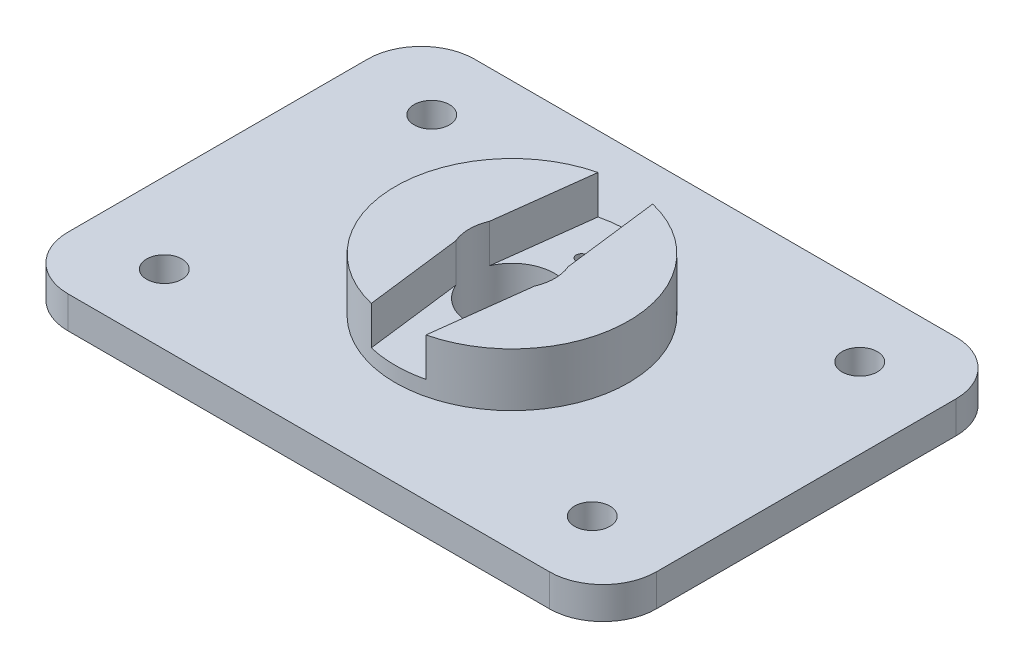
ISO-10303-21;
HEADER;
FILE_DESCRIPTION(('STEP AP214'),'2;1');
FILE_NAME('part.step','',(''),(''),'','','');
FILE_SCHEMA(('AUTOMOTIVE_DESIGN { 1 0 10303 214 1 1 1 1 }'));
ENDSEC;
DATA;
#1=APPLICATION_CONTEXT('core data for automotive mechanical design processes');
#2=APPLICATION_PROTOCOL_DEFINITION('international standard','automotive_design',2000,#1);
#3=PRODUCT_CONTEXT('',#1,'mechanical');
#4=PRODUCT('Part','Part','',(#3));
#5=PRODUCT_RELATED_PRODUCT_CATEGORY('part','',(#4));
#6=PRODUCT_DEFINITION_FORMATION('','',#4);
#7=PRODUCT_DEFINITION_CONTEXT('part definition',#1,'design');
#8=PRODUCT_DEFINITION('design','',#6,#7);
#9=PRODUCT_DEFINITION_SHAPE('','',#8);
#10=(LENGTH_UNIT() NAMED_UNIT(*) SI_UNIT(.MILLI.,.METRE.));
#11=(NAMED_UNIT(*) PLANE_ANGLE_UNIT() SI_UNIT($,.RADIAN.));
#12=(NAMED_UNIT(*) SI_UNIT($,.STERADIAN.) SOLID_ANGLE_UNIT());
#13=UNCERTAINTY_MEASURE_WITH_UNIT(LENGTH_MEASURE(1.E-05),#10,'distance_accuracy_value','');
#14=(GEOMETRIC_REPRESENTATION_CONTEXT(3) GLOBAL_UNCERTAINTY_ASSIGNED_CONTEXT((#13)) GLOBAL_UNIT_ASSIGNED_CONTEXT((#10,
#11,#12)) REPRESENTATION_CONTEXT('',''));
#15=CARTESIAN_POINT('',(0.,0.,0.));
#16=DIRECTION('',(0.,0.,1.));
#17=DIRECTION('',(1.,0.,0.));
#18=AXIS2_PLACEMENT_3D('',#15,#16,#17);
#19=CARTESIAN_POINT('',(22.5,3.,-14.));
#20=DIRECTION('',(0.,1.,0.));
#21=DIRECTION('',(0.,0.,1.));
#22=AXIS2_PLACEMENT_3D('',#19,#20,#21);
#23=CYLINDRICAL_SURFACE('',#22,5.);
#24=DIRECTION('',(0.,1.,0.));
#25=VECTOR('',#24,1.);
#26=CARTESIAN_POINT('',(27.5,3.,-14.));
#27=LINE('',#26,#25);
#28=CARTESIAN_POINT('',(27.5,0.,-14.));
#29=VERTEX_POINT('',#28);
#30=CARTESIAN_POINT('',(27.5,3.,-14.));
#31=VERTEX_POINT('',#30);
#32=EDGE_CURVE('E273',#29,#31,#27,.T.);
#33=ORIENTED_EDGE('',*,*,#32,.F.);
#34=CARTESIAN_POINT('',(22.5,0.,-14.));
#35=DIRECTION('',(0.,1.,0.));
#36=DIRECTION('',(0.,0.,1.));
#37=AXIS2_PLACEMENT_3D('',#34,#35,#36);
#38=CIRCLE('',#37,5.);
#39=CARTESIAN_POINT('',(22.5,0.,-19.));
#40=VERTEX_POINT('',#39);
#41=EDGE_CURVE('E45',#40,#29,#38,.F.);
#42=ORIENTED_EDGE('',*,*,#41,.F.);
#43=DIRECTION('',(0.,1.,0.));
#44=VECTOR('',#43,1.);
#45=CARTESIAN_POINT('',(22.5,3.,-19.));
#46=LINE('',#45,#44);
#47=CARTESIAN_POINT('',(22.5,3.,-19.));
#48=VERTEX_POINT('',#47);
#49=EDGE_CURVE('E276',#48,#40,#46,.F.);
#50=ORIENTED_EDGE('',*,*,#49,.F.);
#51=CARTESIAN_POINT('',(22.5,3.,-14.));
#52=DIRECTION('',(0.,1.,0.));
#53=DIRECTION('',(0.,0.,1.));
#54=AXIS2_PLACEMENT_3D('',#51,#52,#53);
#55=CIRCLE('',#54,5.);
#56=EDGE_CURVE('E11',#31,#48,#55,.T.);
#57=ORIENTED_EDGE('',*,*,#56,.F.);
#58=EDGE_LOOP('',(#33,#42,#50,#57));
#59=FACE_BOUND('',#58,.T.);
#60=ADVANCED_FACE('F38',(#59),#23,.T.);
#61=CARTESIAN_POINT('',(-22.5,3.,-14.));
#62=DIRECTION('',(0.,-1.,0.));
#63=DIRECTION('',(0.,0.,-1.));
#64=AXIS2_PLACEMENT_3D('',#61,#62,#63);
#65=CYLINDRICAL_SURFACE('',#64,5.);
#66=DIRECTION('',(0.,-1.,0.));
#67=VECTOR('',#66,1.);
#68=CARTESIAN_POINT('',(-27.5,3.,-14.));
#69=LINE('',#68,#67);
#70=CARTESIAN_POINT('',(-27.5,3.,-14.));
#71=VERTEX_POINT('',#70);
#72=CARTESIAN_POINT('',(-27.5,0.,-14.));
#73=VERTEX_POINT('',#72);
#74=EDGE_CURVE('E262',#71,#73,#69,.T.);
#75=ORIENTED_EDGE('',*,*,#74,.F.);
#76=CARTESIAN_POINT('',(-22.5,3.,-14.));
#77=DIRECTION('',(0.,1.,0.));
#78=DIRECTION('',(0.,0.,1.));
#79=AXIS2_PLACEMENT_3D('',#76,#77,#78);
#80=CIRCLE('',#79,5.);
#81=CARTESIAN_POINT('',(-22.5,3.,-19.));
#82=VERTEX_POINT('',#81);
#83=EDGE_CURVE('E268',#82,#71,#80,.T.);
#84=ORIENTED_EDGE('',*,*,#83,.F.);
#85=DIRECTION('',(0.,-1.,0.));
#86=VECTOR('',#85,1.);
#87=CARTESIAN_POINT('',(-22.5,3.,-19.));
#88=LINE('',#87,#86);
#89=CARTESIAN_POINT('',(-22.5,0.,-19.));
#90=VERTEX_POINT('',#89);
#91=EDGE_CURVE('E265',#90,#82,#88,.F.);
#92=ORIENTED_EDGE('',*,*,#91,.F.);
#93=CARTESIAN_POINT('',(-22.5,0.,-14.));
#94=DIRECTION('',(0.,1.,0.));
#95=DIRECTION('',(0.,0.,1.));
#96=AXIS2_PLACEMENT_3D('',#93,#94,#95);
#97=CIRCLE('',#96,5.);
#98=EDGE_CURVE('E270',#73,#90,#97,.F.);
#99=ORIENTED_EDGE('',*,*,#98,.F.);
#100=EDGE_LOOP('',(#75,#84,#92,#99));
#101=FACE_BOUND('',#100,.T.);
#102=ADVANCED_FACE('F306',(#101),#65,.T.);
#103=CARTESIAN_POINT('',(-22.5,3.,14.));
#104=DIRECTION('',(0.,-1.,0.));
#105=DIRECTION('',(0.,0.,-1.));
#106=AXIS2_PLACEMENT_3D('',#103,#104,#105);
#107=CYLINDRICAL_SURFACE('',#106,5.);
#108=DIRECTION('',(0.,-1.,0.));
#109=VECTOR('',#108,1.);
#110=CARTESIAN_POINT('',(-22.5,3.,19.));
#111=LINE('',#110,#109);
#112=CARTESIAN_POINT('',(-22.5,3.,19.));
#113=VERTEX_POINT('',#112);
#114=CARTESIAN_POINT('',(-22.5,0.,19.));
#115=VERTEX_POINT('',#114);
#116=EDGE_CURVE('E251',#113,#115,#111,.T.);
#117=ORIENTED_EDGE('',*,*,#116,.F.);
#118=CARTESIAN_POINT('',(-22.5,3.,14.));
#119=DIRECTION('',(0.,1.,0.));
#120=DIRECTION('',(0.,0.,1.));
#121=AXIS2_PLACEMENT_3D('',#118,#119,#120);
#122=CIRCLE('',#121,5.);
#123=CARTESIAN_POINT('',(-27.5,3.,14.));
#124=VERTEX_POINT('',#123);
#125=EDGE_CURVE('E257',#124,#113,#122,.T.);
#126=ORIENTED_EDGE('',*,*,#125,.F.);
#127=DIRECTION('',(0.,-1.,0.));
#128=VECTOR('',#127,1.);
#129=CARTESIAN_POINT('',(-27.5,3.,14.));
#130=LINE('',#129,#128);
#131=CARTESIAN_POINT('',(-27.5,0.,14.));
#132=VERTEX_POINT('',#131);
#133=EDGE_CURVE('E254',#132,#124,#130,.F.);
#134=ORIENTED_EDGE('',*,*,#133,.F.);
#135=CARTESIAN_POINT('',(-22.5,0.,14.));
#136=DIRECTION('',(0.,1.,0.));
#137=DIRECTION('',(0.,0.,1.));
#138=AXIS2_PLACEMENT_3D('',#135,#136,#137);
#139=CIRCLE('',#138,5.);
#140=EDGE_CURVE('E259',#115,#132,#139,.F.);
#141=ORIENTED_EDGE('',*,*,#140,.F.);
#142=EDGE_LOOP('',(#117,#126,#134,#141));
#143=FACE_BOUND('',#142,.T.);
#144=ADVANCED_FACE('F298',(#143),#107,.T.);
#145=CARTESIAN_POINT('',(22.5,3.,14.));
#146=DIRECTION('',(0.,-1.,0.));
#147=DIRECTION('',(0.,0.,-1.));
#148=AXIS2_PLACEMENT_3D('',#145,#146,#147);
#149=CYLINDRICAL_SURFACE('',#148,5.);
#150=DIRECTION('',(0.,-1.,0.));
#151=VECTOR('',#150,1.);
#152=CARTESIAN_POINT('',(27.5,3.,14.));
#153=LINE('',#152,#151);
#154=CARTESIAN_POINT('',(27.5,3.,14.));
#155=VERTEX_POINT('',#154);
#156=CARTESIAN_POINT('',(27.5,0.,14.));
#157=VERTEX_POINT('',#156);
#158=EDGE_CURVE('E158',#155,#157,#153,.T.);
#159=ORIENTED_EDGE('',*,*,#158,.F.);
#160=CARTESIAN_POINT('',(22.5,3.,14.));
#161=DIRECTION('',(0.,1.,0.));
#162=DIRECTION('',(0.,0.,1.));
#163=AXIS2_PLACEMENT_3D('',#160,#161,#162);
#164=CIRCLE('',#163,5.);
#165=CARTESIAN_POINT('',(22.5,3.,19.));
#166=VERTEX_POINT('',#165);
#167=EDGE_CURVE('E246',#166,#155,#164,.T.);
#168=ORIENTED_EDGE('',*,*,#167,.F.);
#169=DIRECTION('',(0.,-1.,0.));
#170=VECTOR('',#169,1.);
#171=CARTESIAN_POINT('',(22.5,3.,19.));
#172=LINE('',#171,#170);
#173=CARTESIAN_POINT('',(22.5,0.,19.));
#174=VERTEX_POINT('',#173);
#175=EDGE_CURVE('E243',#174,#166,#172,.F.);
#176=ORIENTED_EDGE('',*,*,#175,.F.);
#177=CARTESIAN_POINT('',(22.5,0.,14.));
#178=DIRECTION('',(0.,1.,0.));
#179=DIRECTION('',(0.,0.,1.));
#180=AXIS2_PLACEMENT_3D('',#177,#178,#179);
#181=CIRCLE('',#180,5.);
#182=EDGE_CURVE('E248',#157,#174,#181,.F.);
#183=ORIENTED_EDGE('',*,*,#182,.F.);
#184=EDGE_LOOP('',(#159,#168,#176,#183));
#185=FACE_BOUND('',#184,.T.);
#186=ADVANCED_FACE('F287',(#185),#149,.T.);
#187=CARTESIAN_POINT('',(0.,8.,0.));
#188=DIRECTION('',(0.,1.,0.));
#189=DIRECTION('',(0.,0.,1.));
#190=AXIS2_PLACEMENT_3D('',#187,#188,#189);
#191=PLANE('',#190);
#192=DIRECTION('',(-0.123207360520907,0.,0.992380948181429));
#193=VECTOR('',#192,1.);
#194=CARTESIAN_POINT('',(-3.67480993884706,8.,-1.57980122589865));
#195=LINE('',#194,#193);
#196=CARTESIAN_POINT('',(-2.55539130799865,8.,-10.5962245759046));
#197=VERTEX_POINT('',#196);
#198=CARTESIAN_POINT('',(-3.67480993884706,8.,-1.57980122589865));
#199=VERTEX_POINT('',#198);
#200=EDGE_CURVE('E167',#197,#199,#195,.T.);
#201=ORIENTED_EDGE('',*,*,#200,.F.);
#202=CARTESIAN_POINT('',(0.,8.,0.));
#203=DIRECTION('',(0.,1.,0.));
#204=DIRECTION('',(0.,0.,1.));
#205=AXIS2_PLACEMENT_3D('',#202,#203,#204);
#206=CIRCLE('',#205,10.9);
#207=CARTESIAN_POINT('',(-2.55539130799865,8.,10.5962245759046));
#208=VERTEX_POINT('',#207);
#209=EDGE_CURVE('E221',#197,#208,#206,.T.);
#210=ORIENTED_EDGE('',*,*,#209,.T.);
#211=DIRECTION('',(0.123207360520907,0.,0.992380948181429));
#212=VECTOR('',#211,1.);
#213=CARTESIAN_POINT('',(-3.67480993884706,8.,1.57980122589865));
#214=LINE('',#213,#212);
#215=CARTESIAN_POINT('',(-3.67480993884706,8.,1.57980122589865));
#216=VERTEX_POINT('',#215);
#217=EDGE_CURVE('E186',#216,#208,#214,.T.);
#218=ORIENTED_EDGE('',*,*,#217,.F.);
#219=CARTESIAN_POINT('',(0.,8.,0.));
#220=DIRECTION('',(0.,-1.,0.));
#221=DIRECTION('',(0.,0.,-1.));
#222=AXIS2_PLACEMENT_3D('',#219,#220,#221);
#223=CIRCLE('',#222,4.);
#224=EDGE_CURVE('E211',#216,#199,#223,.T.);
#225=ORIENTED_EDGE('',*,*,#224,.T.);
#226=EDGE_LOOP('',(#201,#210,#218,#225));
#227=FACE_BOUND('',#226,.T.);
#228=ADVANCED_FACE('F336',(#227),#191,.T.);
#229=CARTESIAN_POINT('',(27.5,3.,-19.));
#230=DIRECTION('',(-1.,0.,0.));
#231=DIRECTION('',(0.,0.,1.));
#232=AXIS2_PLACEMENT_3D('',#229,#230,#231);
#233=PLANE('',#232);
#234=DIRECTION('',(0.,0.,-1.));
#235=VECTOR('',#234,1.);
#236=CARTESIAN_POINT('',(27.5,0.,-19.));
#237=LINE('',#236,#235);
#238=EDGE_CURVE('E220',#157,#29,#237,.T.);
#239=ORIENTED_EDGE('',*,*,#238,.T.);
#240=ORIENTED_EDGE('',*,*,#32,.T.);
#241=DIRECTION('',(0.,0.,-1.));
#242=VECTOR('',#241,1.);
#243=CARTESIAN_POINT('',(27.5,3.,-19.));
#244=LINE('',#243,#242);
#245=EDGE_CURVE('E224',#155,#31,#244,.T.);
#246=ORIENTED_EDGE('',*,*,#245,.F.);
#247=ORIENTED_EDGE('',*,*,#158,.T.);
#248=EDGE_LOOP('',(#239,#240,#246,#247));
#249=FACE_BOUND('',#248,.T.);
#250=ADVANCED_FACE('F283',(#249),#233,.F.);
#251=CARTESIAN_POINT('',(-27.5,3.,-19.));
#252=DIRECTION('',(0.,0.,1.));
#253=DIRECTION('',(1.,0.,0.));
#254=AXIS2_PLACEMENT_3D('',#251,#252,#253);
#255=PLANE('',#254);
#256=DIRECTION('',(-1.,0.,0.));
#257=VECTOR('',#256,1.);
#258=CARTESIAN_POINT('',(-27.5,3.,-19.));
#259=LINE('',#258,#257);
#260=EDGE_CURVE('E226',#48,#82,#259,.T.);
#261=ORIENTED_EDGE('',*,*,#260,.F.);
#262=ORIENTED_EDGE('',*,*,#49,.T.);
#263=DIRECTION('',(-1.,0.,0.));
#264=VECTOR('',#263,1.);
#265=CARTESIAN_POINT('',(-27.5,0.,-19.));
#266=LINE('',#265,#264);
#267=EDGE_CURVE('E235',#40,#90,#266,.T.);
#268=ORIENTED_EDGE('',*,*,#267,.T.);
#269=ORIENTED_EDGE('',*,*,#91,.T.);
#270=EDGE_LOOP('',(#261,#262,#268,#269));
#271=FACE_BOUND('',#270,.T.);
#272=ADVANCED_FACE('F309',(#271),#255,.F.);
#273=CARTESIAN_POINT('',(-27.5,3.,-19.));
#274=DIRECTION('',(1.,0.,0.));
#275=DIRECTION('',(0.,0.,-1.));
#276=AXIS2_PLACEMENT_3D('',#273,#274,#275);
#277=PLANE('',#276);
#278=DIRECTION('',(0.,0.,1.));
#279=VECTOR('',#278,1.);
#280=CARTESIAN_POINT('',(-27.5,3.,-19.));
#281=LINE('',#280,#279);
#282=EDGE_CURVE('E229',#71,#124,#281,.T.);
#283=ORIENTED_EDGE('',*,*,#282,.F.);
#284=ORIENTED_EDGE('',*,*,#74,.T.);
#285=DIRECTION('',(0.,0.,1.));
#286=VECTOR('',#285,1.);
#287=CARTESIAN_POINT('',(-27.5,0.,-19.));
#288=LINE('',#287,#286);
#289=EDGE_CURVE('E237',#73,#132,#288,.T.);
#290=ORIENTED_EDGE('',*,*,#289,.T.);
#291=ORIENTED_EDGE('',*,*,#133,.T.);
#292=EDGE_LOOP('',(#283,#284,#290,#291));
#293=FACE_BOUND('',#292,.T.);
#294=ADVANCED_FACE('F301',(#293),#277,.F.);
#295=CARTESIAN_POINT('',(-27.5,3.,19.));
#296=DIRECTION('',(0.,0.,-1.));
#297=DIRECTION('',(-1.,0.,0.));
#298=AXIS2_PLACEMENT_3D('',#295,#296,#297);
#299=PLANE('',#298);
#300=DIRECTION('',(1.,0.,0.));
#301=VECTOR('',#300,1.);
#302=CARTESIAN_POINT('',(-27.5,3.,19.));
#303=LINE('',#302,#301);
#304=EDGE_CURVE('E231',#113,#166,#303,.T.);
#305=ORIENTED_EDGE('',*,*,#304,.F.);
#306=ORIENTED_EDGE('',*,*,#116,.T.);
#307=DIRECTION('',(1.,0.,0.));
#308=VECTOR('',#307,1.);
#309=CARTESIAN_POINT('',(-27.5,0.,19.));
#310=LINE('',#309,#308);
#311=EDGE_CURVE('E227',#115,#174,#310,.T.);
#312=ORIENTED_EDGE('',*,*,#311,.T.);
#313=ORIENTED_EDGE('',*,*,#175,.T.);
#314=EDGE_LOOP('',(#305,#306,#312,#313));
#315=FACE_BOUND('',#314,.T.);
#316=ADVANCED_FACE('F294',(#315),#299,.F.);
#317=CARTESIAN_POINT('',(0.,3.,0.));
#318=DIRECTION('',(0.,1.,0.));
#319=DIRECTION('',(0.,0.,1.));
#320=AXIS2_PLACEMENT_3D('',#317,#318,#319);
#321=PLANE('',#320);
#322=CARTESIAN_POINT('',(20.,3.,12.5));
#323=DIRECTION('',(0.,1.,0.));
#324=DIRECTION('',(0.,0.,1.));
#325=AXIS2_PLACEMENT_3D('',#322,#323,#324);
#326=CIRCLE('',#325,1.65);
#327=CARTESIAN_POINT('',(20.,3.,14.15));
#328=VERTEX_POINT('',#327);
#329=EDGE_CURVE('E657',#328,#328,#326,.T.);
#330=ORIENTED_EDGE('',*,*,#329,.F.);
#331=EDGE_LOOP('',(#330));
#332=FACE_BOUND('',#331,.T.);
#333=CARTESIAN_POINT('',(20.,3.,-12.5));
#334=DIRECTION('',(0.,1.,0.));
#335=DIRECTION('',(0.,0.,1.));
#336=AXIS2_PLACEMENT_3D('',#333,#334,#335);
#337=CIRCLE('',#336,1.65);
#338=CARTESIAN_POINT('',(20.,3.,-10.85));
#339=VERTEX_POINT('',#338);
#340=EDGE_CURVE('E660',#339,#339,#337,.T.);
#341=ORIENTED_EDGE('',*,*,#340,.F.);
#342=EDGE_LOOP('',(#341));
#343=FACE_BOUND('',#342,.T.);
#344=CARTESIAN_POINT('',(-20.,3.,-12.5));
#345=DIRECTION('',(0.,1.,0.));
#346=DIRECTION('',(0.,0.,1.));
#347=AXIS2_PLACEMENT_3D('',#344,#345,#346);
#348=CIRCLE('',#347,1.65);
#349=CARTESIAN_POINT('',(-20.,3.,-10.85));
#350=VERTEX_POINT('',#349);
#351=EDGE_CURVE('E663',#350,#350,#348,.T.);
#352=ORIENTED_EDGE('',*,*,#351,.F.);
#353=EDGE_LOOP('',(#352));
#354=FACE_BOUND('',#353,.T.);
#355=CARTESIAN_POINT('',(-20.,3.,12.5));
#356=DIRECTION('',(0.,1.,0.));
#357=DIRECTION('',(0.,0.,1.));
#358=AXIS2_PLACEMENT_3D('',#355,#356,#357);
#359=CIRCLE('',#358,1.65);
#360=CARTESIAN_POINT('',(-20.,3.,14.15));
#361=VERTEX_POINT('',#360);
#362=EDGE_CURVE('E649',#361,#361,#359,.T.);
#363=ORIENTED_EDGE('',*,*,#362,.F.);
#364=EDGE_LOOP('',(#363));
#365=FACE_BOUND('',#364,.T.);
#366=CARTESIAN_POINT('',(0.,3.,0.));
#367=DIRECTION('',(0.,1.,0.));
#368=DIRECTION('',(0.,0.,1.));
#369=AXIS2_PLACEMENT_3D('',#366,#367,#368);
#370=CIRCLE('',#369,10.9);
#371=CARTESIAN_POINT('',(0.,3.,10.9));
#372=VERTEX_POINT('',#371);
#373=EDGE_CURVE('E214',#372,#372,#370,.T.);
#374=ORIENTED_EDGE('',*,*,#373,.F.);
#375=EDGE_LOOP('',(#374));
#376=FACE_BOUND('',#375,.T.);
#377=ORIENTED_EDGE('',*,*,#245,.T.);
#378=ORIENTED_EDGE('',*,*,#56,.T.);
#379=ORIENTED_EDGE('',*,*,#260,.T.);
#380=ORIENTED_EDGE('',*,*,#83,.T.);
#381=ORIENTED_EDGE('',*,*,#282,.T.);
#382=ORIENTED_EDGE('',*,*,#125,.T.);
#383=ORIENTED_EDGE('',*,*,#304,.T.);
#384=ORIENTED_EDGE('',*,*,#167,.T.);
#385=EDGE_LOOP('',(#377,#378,#379,#380,#381,#382,#383,#384));
#386=FACE_BOUND('',#385,.T.);
#387=ADVANCED_FACE('F310',(#332,#343,#354,#365,#376,#386),#321,.T.);
#388=CARTESIAN_POINT('',(0.,0.,0.));
#389=DIRECTION('',(0.,1.,0.));
#390=DIRECTION('',(0.,0.,1.));
#391=AXIS2_PLACEMENT_3D('',#388,#389,#390);
#392=PLANE('',#391);
#393=CARTESIAN_POINT('',(20.,0.,12.5));
#394=DIRECTION('',(0.,-1.,0.));
#395=DIRECTION('',(0.,0.,-1.));
#396=AXIS2_PLACEMENT_3D('',#393,#394,#395);
#397=CIRCLE('',#396,1.65);
#398=CARTESIAN_POINT('',(20.,0.,10.85));
#399=VERTEX_POINT('',#398);
#400=EDGE_CURVE('E666',#399,#399,#397,.T.);
#401=ORIENTED_EDGE('',*,*,#400,.F.);
#402=EDGE_LOOP('',(#401));
#403=FACE_BOUND('',#402,.T.);
#404=CARTESIAN_POINT('',(20.,0.,-12.5));
#405=DIRECTION('',(0.,-1.,0.));
#406=DIRECTION('',(0.,0.,-1.));
#407=AXIS2_PLACEMENT_3D('',#404,#405,#406);
#408=CIRCLE('',#407,1.65);
#409=CARTESIAN_POINT('',(20.,0.,-14.15));
#410=VERTEX_POINT('',#409);
#411=EDGE_CURVE('E670',#410,#410,#408,.T.);
#412=ORIENTED_EDGE('',*,*,#411,.F.);
#413=EDGE_LOOP('',(#412));
#414=FACE_BOUND('',#413,.T.);
#415=CARTESIAN_POINT('',(-20.,0.,-12.5));
#416=DIRECTION('',(0.,-1.,0.));
#417=DIRECTION('',(0.,0.,-1.));
#418=AXIS2_PLACEMENT_3D('',#415,#416,#417);
#419=CIRCLE('',#418,1.65);
#420=CARTESIAN_POINT('',(-20.,0.,-14.15));
#421=VERTEX_POINT('',#420);
#422=EDGE_CURVE('E667',#421,#421,#419,.T.);
#423=ORIENTED_EDGE('',*,*,#422,.F.);
#424=EDGE_LOOP('',(#423));
#425=FACE_BOUND('',#424,.T.);
#426=CARTESIAN_POINT('',(-20.,0.,12.5));
#427=DIRECTION('',(0.,-1.,0.));
#428=DIRECTION('',(0.,0.,-1.));
#429=AXIS2_PLACEMENT_3D('',#426,#427,#428);
#430=CIRCLE('',#429,1.65);
#431=CARTESIAN_POINT('',(-20.,0.,10.85));
#432=VERTEX_POINT('',#431);
#433=EDGE_CURVE('E654',#432,#432,#430,.T.);
#434=ORIENTED_EDGE('',*,*,#433,.F.);
#435=EDGE_LOOP('',(#434));
#436=FACE_BOUND('',#435,.T.);
#437=CARTESIAN_POINT('',(0.,0.,0.));
#438=DIRECTION('',(0.,-1.,0.));
#439=DIRECTION('',(0.,0.,-1.));
#440=AXIS2_PLACEMENT_3D('',#437,#438,#439);
#441=CIRCLE('',#440,4.);
#442=CARTESIAN_POINT('',(0.,0.,-4.));
#443=VERTEX_POINT('',#442);
#444=EDGE_CURVE('E210',#443,#443,#441,.T.);
#445=ORIENTED_EDGE('',*,*,#444,.F.);
#446=EDGE_LOOP('',(#445));
#447=FACE_BOUND('',#446,.T.);
#448=ORIENTED_EDGE('',*,*,#267,.F.);
#449=ORIENTED_EDGE('',*,*,#41,.T.);
#450=ORIENTED_EDGE('',*,*,#238,.F.);
#451=ORIENTED_EDGE('',*,*,#182,.T.);
#452=ORIENTED_EDGE('',*,*,#311,.F.);
#453=ORIENTED_EDGE('',*,*,#140,.T.);
#454=ORIENTED_EDGE('',*,*,#289,.F.);
#455=ORIENTED_EDGE('',*,*,#98,.T.);
#456=EDGE_LOOP('',(#448,#449,#450,#451,#452,#453,#454,#455));
#457=FACE_BOUND('',#456,.T.);
#458=ADVANCED_FACE('F280',(#403,#414,#425,#436,#447,#457),#392,.F.);
#459=CARTESIAN_POINT('',(0.,8.,0.));
#460=DIRECTION('',(0.,-1.,0.));
#461=DIRECTION('',(0.,0.,-1.));
#462=AXIS2_PLACEMENT_3D('',#459,#460,#461);
#463=CYLINDRICAL_SURFACE('',#462,10.9);
#464=ORIENTED_EDGE('',*,*,#209,.F.);
#465=DIRECTION('',(0.,-1.,0.));
#466=VECTOR('',#465,1.);
#467=CARTESIAN_POINT('',(-2.55539130799865,8.,-10.5962245759046));
#468=LINE('',#467,#466);
#469=CARTESIAN_POINT('',(-2.55539130799864,4.4,-10.5962245759046));
#470=VERTEX_POINT('',#469);
#471=EDGE_CURVE('E183',#197,#470,#468,.T.);
#472=ORIENTED_EDGE('',*,*,#471,.T.);
#473=CARTESIAN_POINT('',(0.,4.4,0.));
#474=DIRECTION('',(0.,-1.,0.));
#475=DIRECTION('',(0.,0.,-1.));
#476=AXIS2_PLACEMENT_3D('',#473,#474,#475);
#477=CIRCLE('',#476,10.9);
#478=CARTESIAN_POINT('',(2.55539130799872,4.4,-10.5962245759046));
#479=VERTEX_POINT('',#478);
#480=EDGE_CURVE('E176',#470,#479,#477,.T.);
#481=ORIENTED_EDGE('',*,*,#480,.T.);
#482=DIRECTION('',(0.,-1.,0.));
#483=VECTOR('',#482,1.);
#484=CARTESIAN_POINT('',(2.55539130799872,8.,-10.5962245759046));
#485=LINE('',#484,#483);
#486=CARTESIAN_POINT('',(2.55539130799872,8.,-10.5962245759046));
#487=VERTEX_POINT('',#486);
#488=EDGE_CURVE('E166',#479,#487,#485,.F.);
#489=ORIENTED_EDGE('',*,*,#488,.T.);
#490=CARTESIAN_POINT('',(2.55539130799872,8.,10.5962245759046));
#491=VERTEX_POINT('',#490);
#492=EDGE_CURVE('E217',#491,#487,#206,.T.);
#493=ORIENTED_EDGE('',*,*,#492,.F.);
#494=DIRECTION('',(0.,-1.,0.));
#495=VECTOR('',#494,1.);
#496=CARTESIAN_POINT('',(2.55539130799872,8.,10.5962245759046));
#497=LINE('',#496,#495);
#498=CARTESIAN_POINT('',(2.55539130799872,4.4,10.5962245759046));
#499=VERTEX_POINT('',#498);
#500=EDGE_CURVE('E207',#491,#499,#497,.T.);
#501=ORIENTED_EDGE('',*,*,#500,.T.);
#502=CARTESIAN_POINT('',(0.,4.4,0.));
#503=DIRECTION('',(0.,1.,0.));
#504=DIRECTION('',(0.,0.,1.));
#505=AXIS2_PLACEMENT_3D('',#502,#503,#504);
#506=CIRCLE('',#505,10.9);
#507=CARTESIAN_POINT('',(-2.55539130799864,4.4,10.5962245759046));
#508=VERTEX_POINT('',#507);
#509=EDGE_CURVE('E201',#508,#499,#506,.T.);
#510=ORIENTED_EDGE('',*,*,#509,.F.);
#511=DIRECTION('',(0.,-1.,0.));
#512=VECTOR('',#511,1.);
#513=CARTESIAN_POINT('',(-2.55539130799865,8.,10.5962245759046));
#514=LINE('',#513,#512);
#515=EDGE_CURVE('E204',#508,#208,#514,.F.);
#516=ORIENTED_EDGE('',*,*,#515,.T.);
#517=EDGE_LOOP('',(#464,#472,#481,#489,#493,#501,#510,#516));
#518=FACE_BOUND('',#517,.T.);
#519=ORIENTED_EDGE('',*,*,#373,.T.);
#520=EDGE_LOOP('',(#519));
#521=FACE_BOUND('',#520,.T.);
#522=ADVANCED_FACE('F318',(#518,#521),#463,.T.);
#523=DIRECTION('',(-0.123207360520899,0.,-0.99238094818143));
#524=VECTOR('',#523,1.);
#525=CARTESIAN_POINT('',(3.67480993884706,8.,-1.57980122589865));
#526=LINE('',#525,#524);
#527=CARTESIAN_POINT('',(3.67480993884706,8.,-1.57980122589865));
#528=VERTEX_POINT('',#527);
#529=EDGE_CURVE('E627',#528,#487,#526,.T.);
#530=ORIENTED_EDGE('',*,*,#529,.F.);
#531=CARTESIAN_POINT('',(3.67480993884706,8.,1.57980122589865));
#532=VERTEX_POINT('',#531);
#533=EDGE_CURVE('E173',#528,#532,#223,.T.);
#534=ORIENTED_EDGE('',*,*,#533,.T.);
#535=DIRECTION('',(0.123207360520899,0.,-0.99238094818143));
#536=VECTOR('',#535,1.);
#537=CARTESIAN_POINT('',(3.67480993884706,8.,1.57980122589865));
#538=LINE('',#537,#536);
#539=EDGE_CURVE('E191',#491,#532,#538,.T.);
#540=ORIENTED_EDGE('',*,*,#539,.F.);
#541=ORIENTED_EDGE('',*,*,#492,.T.);
#542=EDGE_LOOP('',(#530,#534,#540,#541));
#543=FACE_BOUND('',#542,.T.);
#544=ADVANCED_FACE('F507',(#543),#191,.T.);
#545=CARTESIAN_POINT('',(0.,8.,0.));
#546=DIRECTION('',(0.,-1.,0.));
#547=DIRECTION('',(0.,0.,-1.));
#548=AXIS2_PLACEMENT_3D('',#545,#546,#547);
#549=CYLINDRICAL_SURFACE('',#548,4.);
#550=CARTESIAN_POINT('',(0.,4.4,0.));
#551=DIRECTION('',(0.,-1.,0.));
#552=DIRECTION('',(0.,0.,-1.));
#553=AXIS2_PLACEMENT_3D('',#550,#551,#552);
#554=CIRCLE('',#553,4.);
#555=CARTESIAN_POINT('',(3.67480993884706,4.4,-1.57980122589865));
#556=VERTEX_POINT('',#555);
#557=CARTESIAN_POINT('',(-3.67480993884706,4.4,-1.57980122589865));
#558=VERTEX_POINT('',#557);
#559=EDGE_CURVE('E148',#556,#558,#554,.F.);
#560=ORIENTED_EDGE('',*,*,#559,.T.);
#561=DIRECTION('',(0.,1.,0.));
#562=VECTOR('',#561,1.);
#563=CARTESIAN_POINT('',(-3.67480993884706,4.4,-1.57980122589865));
#564=LINE('',#563,#562);
#565=EDGE_CURVE('E174',#558,#199,#564,.T.);
#566=ORIENTED_EDGE('',*,*,#565,.T.);
#567=ORIENTED_EDGE('',*,*,#224,.F.);
#568=DIRECTION('',(0.,1.,0.));
#569=VECTOR('',#568,1.);
#570=CARTESIAN_POINT('',(-3.67480993884706,4.4,1.57980122589865));
#571=LINE('',#570,#569);
#572=CARTESIAN_POINT('',(-3.67480993884706,4.4,1.57980122589865));
#573=VERTEX_POINT('',#572);
#574=EDGE_CURVE('E194',#573,#216,#571,.T.);
#575=ORIENTED_EDGE('',*,*,#574,.F.);
#576=CARTESIAN_POINT('',(0.,4.4,0.));
#577=DIRECTION('',(0.,1.,0.));
#578=DIRECTION('',(0.,0.,1.));
#579=AXIS2_PLACEMENT_3D('',#576,#577,#578);
#580=CIRCLE('',#579,4.);
#581=CARTESIAN_POINT('',(3.67480993884706,4.4,1.57980122589865));
#582=VERTEX_POINT('',#581);
#583=EDGE_CURVE('E159',#582,#573,#580,.F.);
#584=ORIENTED_EDGE('',*,*,#583,.F.);
#585=DIRECTION('',(0.,1.,0.));
#586=VECTOR('',#585,1.);
#587=CARTESIAN_POINT('',(3.67480993884706,4.4,1.57980122589865));
#588=LINE('',#587,#586);
#589=EDGE_CURVE('E199',#582,#532,#588,.T.);
#590=ORIENTED_EDGE('',*,*,#589,.T.);
#591=ORIENTED_EDGE('',*,*,#533,.F.);
#592=DIRECTION('',(0.,1.,0.));
#593=VECTOR('',#592,1.);
#594=CARTESIAN_POINT('',(3.67480993884706,4.4,-1.57980122589865));
#595=LINE('',#594,#593);
#596=EDGE_CURVE('E163',#556,#528,#595,.T.);
#597=ORIENTED_EDGE('',*,*,#596,.F.);
#598=EDGE_LOOP('',(#560,#566,#567,#575,#584,#590,#591,#597));
#599=FACE_BOUND('',#598,.T.);
#600=ORIENTED_EDGE('',*,*,#444,.T.);
#601=EDGE_LOOP('',(#600));
#602=FACE_BOUND('',#601,.T.);
#603=ADVANCED_FACE('F170',(#599,#602),#549,.F.);
#604=CARTESIAN_POINT('',(3.67480993884706,4.4,1.57980122589865));
#605=DIRECTION('',(0.99238094818143,0.,0.123207360520899));
#606=DIRECTION('',(0.123207360520899,0.,-0.99238094818143));
#607=AXIS2_PLACEMENT_3D('',#604,#605,#606);
#608=PLANE('',#607);
#609=ORIENTED_EDGE('',*,*,#539,.T.);
#610=ORIENTED_EDGE('',*,*,#589,.F.);
#611=DIRECTION('',(0.123207360520899,0.,-0.99238094818143));
#612=VECTOR('',#611,1.);
#613=CARTESIAN_POINT('',(3.67480993884706,4.4,1.57980122589865));
#614=LINE('',#613,#612);
#615=EDGE_CURVE('E190',#499,#582,#614,.T.);
#616=ORIENTED_EDGE('',*,*,#615,.F.);
#617=ORIENTED_EDGE('',*,*,#500,.F.);
#618=EDGE_LOOP('',(#609,#610,#616,#617));
#619=FACE_BOUND('',#618,.T.);
#620=ADVANCED_FACE('F492',(#619),#608,.F.);
#621=CARTESIAN_POINT('',(-3.67480993884706,4.4,1.57980122589865));
#622=DIRECTION('',(-0.992380948181429,0.,0.123207360520907));
#623=DIRECTION('',(0.123207360520907,0.,0.992380948181429));
#624=AXIS2_PLACEMENT_3D('',#621,#622,#623);
#625=PLANE('',#624);
#626=DIRECTION('',(0.123207360520907,0.,0.992380948181429));
#627=VECTOR('',#626,1.);
#628=CARTESIAN_POINT('',(-3.67480993884706,4.4,1.57980122589865));
#629=LINE('',#628,#627);
#630=EDGE_CURVE('E187',#573,#508,#629,.T.);
#631=ORIENTED_EDGE('',*,*,#630,.F.);
#632=ORIENTED_EDGE('',*,*,#574,.T.);
#633=ORIENTED_EDGE('',*,*,#217,.T.);
#634=ORIENTED_EDGE('',*,*,#515,.F.);
#635=EDGE_LOOP('',(#631,#632,#633,#634));
#636=FACE_BOUND('',#635,.T.);
#637=ADVANCED_FACE('F485',(#636),#625,.F.);
#638=CARTESIAN_POINT('',(0.,4.4,0.));
#639=DIRECTION('',(0.,1.,0.));
#640=DIRECTION('',(0.,0.,1.));
#641=AXIS2_PLACEMENT_3D('',#638,#639,#640);
#642=PLANE('',#641);
#643=CARTESIAN_POINT('',(0.,4.4,6.5));
#644=DIRECTION('',(0.,1.,0.));
#645=DIRECTION('',(0.,0.,1.));
#646=AXIS2_PLACEMENT_3D('',#643,#644,#645);
#647=CIRCLE('',#646,0.5);
#648=CARTESIAN_POINT('',(0.,4.4,7.));
#649=VERTEX_POINT('',#648);
#650=EDGE_CURVE('E640',#649,#649,#647,.T.);
#651=ORIENTED_EDGE('',*,*,#650,.F.);
#652=EDGE_LOOP('',(#651));
#653=FACE_BOUND('',#652,.T.);
#654=ORIENTED_EDGE('',*,*,#509,.T.);
#655=ORIENTED_EDGE('',*,*,#615,.T.);
#656=ORIENTED_EDGE('',*,*,#583,.T.);
#657=ORIENTED_EDGE('',*,*,#630,.T.);
#658=EDGE_LOOP('',(#654,#655,#656,#657));
#659=FACE_BOUND('',#658,.T.);
#660=ADVANCED_FACE('F477',(#653,#659),#642,.T.);
#661=CARTESIAN_POINT('',(-3.67480993884706,4.4,-1.57980122589865));
#662=DIRECTION('',(-0.992380948181429,0.,-0.123207360520907));
#663=DIRECTION('',(-0.123207360520907,0.,0.992380948181429));
#664=AXIS2_PLACEMENT_3D('',#661,#662,#663);
#665=PLANE('',#664);
#666=ORIENTED_EDGE('',*,*,#200,.T.);
#667=ORIENTED_EDGE('',*,*,#565,.F.);
#668=DIRECTION('',(-0.123207360520907,0.,0.992380948181429));
#669=VECTOR('',#668,1.);
#670=CARTESIAN_POINT('',(-3.67480993884706,4.4,-1.57980122589865));
#671=LINE('',#670,#669);
#672=EDGE_CURVE('E154',#470,#558,#671,.T.);
#673=ORIENTED_EDGE('',*,*,#672,.F.);
#674=ORIENTED_EDGE('',*,*,#471,.F.);
#675=EDGE_LOOP('',(#666,#667,#673,#674));
#676=FACE_BOUND('',#675,.T.);
#677=ADVANCED_FACE('F470',(#676),#665,.F.);
#678=CARTESIAN_POINT('',(3.67480993884706,4.4,-1.57980122589865));
#679=DIRECTION('',(0.99238094818143,0.,-0.123207360520899));
#680=DIRECTION('',(-0.123207360520899,0.,-0.99238094818143));
#681=AXIS2_PLACEMENT_3D('',#678,#679,#680);
#682=PLANE('',#681);
#683=DIRECTION('',(-0.123207360520899,0.,-0.99238094818143));
#684=VECTOR('',#683,1.);
#685=CARTESIAN_POINT('',(3.67480993884706,4.4,-1.57980122589865));
#686=LINE('',#685,#684);
#687=EDGE_CURVE('E151',#556,#479,#686,.T.);
#688=ORIENTED_EDGE('',*,*,#687,.F.);
#689=ORIENTED_EDGE('',*,*,#596,.T.);
#690=ORIENTED_EDGE('',*,*,#529,.T.);
#691=ORIENTED_EDGE('',*,*,#488,.F.);
#692=EDGE_LOOP('',(#688,#689,#690,#691));
#693=FACE_BOUND('',#692,.T.);
#694=ADVANCED_FACE('F162',(#693),#682,.F.);
#695=CARTESIAN_POINT('',(0.,4.4,0.));
#696=DIRECTION('',(0.,-1.,0.));
#697=DIRECTION('',(0.,0.,-1.));
#698=AXIS2_PLACEMENT_3D('',#695,#696,#697);
#699=PLANE('',#698);
#700=CARTESIAN_POINT('',(0.,4.4,-6.5));
#701=DIRECTION('',(0.,1.,0.));
#702=DIRECTION('',(0.,0.,1.));
#703=AXIS2_PLACEMENT_3D('',#700,#701,#702);
#704=CIRCLE('',#703,0.5);
#705=CARTESIAN_POINT('',(0.,4.4,-6.));
#706=VERTEX_POINT('',#705);
#707=EDGE_CURVE('E646',#706,#706,#704,.T.);
#708=ORIENTED_EDGE('',*,*,#707,.F.);
#709=EDGE_LOOP('',(#708));
#710=FACE_BOUND('',#709,.T.);
#711=ORIENTED_EDGE('',*,*,#672,.T.);
#712=ORIENTED_EDGE('',*,*,#559,.F.);
#713=ORIENTED_EDGE('',*,*,#687,.T.);
#714=ORIENTED_EDGE('',*,*,#480,.F.);
#715=EDGE_LOOP('',(#711,#712,#713,#714));
#716=FACE_BOUND('',#715,.T.);
#717=ADVANCED_FACE('F150',(#710,#716),#699,.F.);
#718=CARTESIAN_POINT('',(0.,0.399999999999997,6.5));
#719=DIRECTION('',(0.,1.,0.));
#720=DIRECTION('',(0.,0.,1.));
#721=AXIS2_PLACEMENT_3D('',#718,#719,#720);
#722=CYLINDRICAL_SURFACE('',#721,0.5);
#723=CARTESIAN_POINT('',(0.,0.399999999999997,6.5));
#724=DIRECTION('',(0.,1.,0.));
#725=DIRECTION('',(0.,0.,1.));
#726=AXIS2_PLACEMENT_3D('',#723,#724,#725);
#727=CIRCLE('',#726,0.5);
#728=CARTESIAN_POINT('',(0.,0.399999999999997,7.));
#729=VERTEX_POINT('',#728);
#730=EDGE_CURVE('E637',#729,#729,#727,.T.);
#731=ORIENTED_EDGE('',*,*,#730,.F.);
#732=EDGE_LOOP('',(#731));
#733=FACE_BOUND('',#732,.T.);
#734=ORIENTED_EDGE('',*,*,#650,.T.);
#735=EDGE_LOOP('',(#734));
#736=FACE_BOUND('',#735,.T.);
#737=ADVANCED_FACE('F447',(#733,#736),#722,.F.);
#738=CARTESIAN_POINT('',(0.,0.399999999999997,6.5));
#739=DIRECTION('',(0.,1.,0.));
#740=DIRECTION('',(0.,0.,1.));
#741=AXIS2_PLACEMENT_3D('',#738,#739,#740);
#742=PLANE('',#741);
#743=ORIENTED_EDGE('',*,*,#730,.T.);
#744=EDGE_LOOP('',(#743));
#745=FACE_BOUND('',#744,.T.);
#746=ADVANCED_FACE('F439',(#745),#742,.T.);
#747=CARTESIAN_POINT('',(0.,0.399999999999997,-6.5));
#748=DIRECTION('',(0.,1.,0.));
#749=DIRECTION('',(0.,0.,1.));
#750=AXIS2_PLACEMENT_3D('',#747,#748,#749);
#751=CYLINDRICAL_SURFACE('',#750,0.5);
#752=CARTESIAN_POINT('',(0.,0.399999999999997,-6.5));
#753=DIRECTION('',(0.,1.,0.));
#754=DIRECTION('',(0.,0.,1.));
#755=AXIS2_PLACEMENT_3D('',#752,#753,#754);
#756=CIRCLE('',#755,0.5);
#757=CARTESIAN_POINT('',(0.,0.399999999999997,-6.));
#758=VERTEX_POINT('',#757);
#759=EDGE_CURVE('E644',#758,#758,#756,.T.);
#760=ORIENTED_EDGE('',*,*,#759,.F.);
#761=EDGE_LOOP('',(#760));
#762=FACE_BOUND('',#761,.T.);
#763=ORIENTED_EDGE('',*,*,#707,.T.);
#764=EDGE_LOOP('',(#763));
#765=FACE_BOUND('',#764,.T.);
#766=ADVANCED_FACE('F431',(#762,#765),#751,.F.);
#767=CARTESIAN_POINT('',(0.,0.399999999999997,-6.5));
#768=DIRECTION('',(0.,1.,0.));
#769=DIRECTION('',(0.,0.,1.));
#770=AXIS2_PLACEMENT_3D('',#767,#768,#769);
#771=PLANE('',#770);
#772=ORIENTED_EDGE('',*,*,#759,.T.);
#773=EDGE_LOOP('',(#772));
#774=FACE_BOUND('',#773,.T.);
#775=ADVANCED_FACE('F386',(#774),#771,.T.);
#776=CARTESIAN_POINT('',(-20.,8.,12.5));
#777=DIRECTION('',(0.,-1.,0.));
#778=DIRECTION('',(0.,0.,-1.));
#779=AXIS2_PLACEMENT_3D('',#776,#777,#778);
#780=CYLINDRICAL_SURFACE('',#779,1.65);
#781=ORIENTED_EDGE('',*,*,#362,.T.);
#782=EDGE_LOOP('',(#781));
#783=FACE_BOUND('',#782,.T.);
#784=ORIENTED_EDGE('',*,*,#433,.T.);
#785=EDGE_LOOP('',(#784));
#786=FACE_BOUND('',#785,.T.);
#787=ADVANCED_FACE('F379',(#783,#786),#780,.F.);
#788=CARTESIAN_POINT('',(-20.,8.,-12.5));
#789=DIRECTION('',(0.,-1.,0.));
#790=DIRECTION('',(0.,0.,-1.));
#791=AXIS2_PLACEMENT_3D('',#788,#789,#790);
#792=CYLINDRICAL_SURFACE('',#791,1.65);
#793=ORIENTED_EDGE('',*,*,#351,.T.);
#794=EDGE_LOOP('',(#793));
#795=FACE_BOUND('',#794,.T.);
#796=ORIENTED_EDGE('',*,*,#422,.T.);
#797=EDGE_LOOP('',(#796));
#798=FACE_BOUND('',#797,.T.);
#799=ADVANCED_FACE('F385',(#795,#798),#792,.F.);
#800=CARTESIAN_POINT('',(20.,8.,-12.5));
#801=DIRECTION('',(0.,-1.,0.));
#802=DIRECTION('',(0.,0.,-1.));
#803=AXIS2_PLACEMENT_3D('',#800,#801,#802);
#804=CYLINDRICAL_SURFACE('',#803,1.65);
#805=ORIENTED_EDGE('',*,*,#340,.T.);
#806=EDGE_LOOP('',(#805));
#807=FACE_BOUND('',#806,.T.);
#808=ORIENTED_EDGE('',*,*,#411,.T.);
#809=EDGE_LOOP('',(#808));
#810=FACE_BOUND('',#809,.T.);
#811=ADVANCED_FACE('F398',(#807,#810),#804,.F.);
#812=CARTESIAN_POINT('',(20.,8.,12.5));
#813=DIRECTION('',(0.,-1.,0.));
#814=DIRECTION('',(0.,0.,-1.));
#815=AXIS2_PLACEMENT_3D('',#812,#813,#814);
#816=CYLINDRICAL_SURFACE('',#815,1.65);
#817=ORIENTED_EDGE('',*,*,#329,.T.);
#818=EDGE_LOOP('',(#817));
#819=FACE_BOUND('',#818,.T.);
#820=ORIENTED_EDGE('',*,*,#400,.T.);
#821=EDGE_LOOP('',(#820));
#822=FACE_BOUND('',#821,.T.);
#823=ADVANCED_FACE('F409',(#819,#822),#816,.F.);
#824=CLOSED_SHELL('',(#60,#102,#144,#186,#228,#250,#272,#294,#316,#387,#458,#522,#544,#603,#620,
#637,#660,#677,#694,#717,#737,#746,#766,#775,#787,#799,#811,#823));
#825=MANIFOLD_SOLID_BREP('B2',#824);
#826=ADVANCED_BREP_SHAPE_REPRESENTATION('',(#18,#825),#14);
#827=SHAPE_DEFINITION_REPRESENTATION(#9,#826);
ENDSEC;
END-ISO-10303-21;
